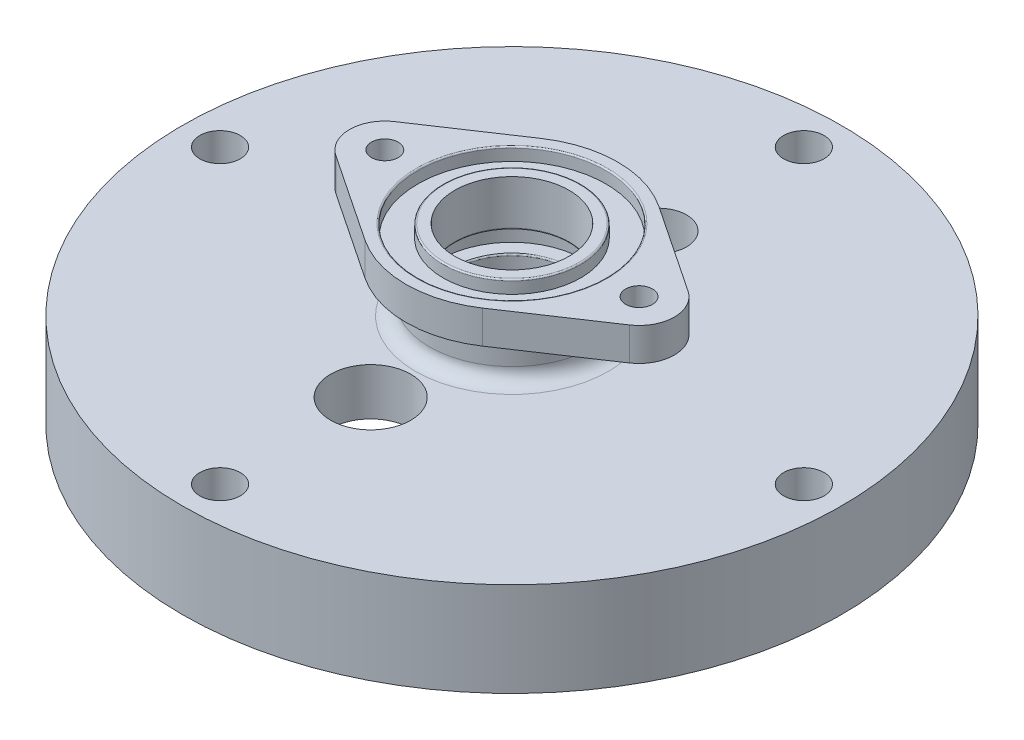
ISO-10303-21;
HEADER;
FILE_DESCRIPTION(('STEP AP214'),'2;1');
FILE_NAME('part.step','',(''),(''),'','','');
FILE_SCHEMA(('AUTOMOTIVE_DESIGN { 1 0 10303 214 1 1 1 1 }'));
ENDSEC;
DATA;
#1=APPLICATION_CONTEXT('core data for automotive mechanical design processes');
#2=APPLICATION_PROTOCOL_DEFINITION('international standard','automotive_design',2000,#1);
#3=PRODUCT_CONTEXT('',#1,'mechanical');
#4=PRODUCT('Part','Part','',(#3));
#5=PRODUCT_RELATED_PRODUCT_CATEGORY('part','',(#4));
#6=PRODUCT_DEFINITION_FORMATION('','',#4);
#7=PRODUCT_DEFINITION_CONTEXT('part definition',#1,'design');
#8=PRODUCT_DEFINITION('design','',#6,#7);
#9=PRODUCT_DEFINITION_SHAPE('','',#8);
#10=(LENGTH_UNIT() NAMED_UNIT(*) SI_UNIT(.MILLI.,.METRE.));
#11=(NAMED_UNIT(*) PLANE_ANGLE_UNIT() SI_UNIT($,.RADIAN.));
#12=(NAMED_UNIT(*) SI_UNIT($,.STERADIAN.) SOLID_ANGLE_UNIT());
#13=UNCERTAINTY_MEASURE_WITH_UNIT(LENGTH_MEASURE(1.E-05),#10,'distance_accuracy_value','');
#14=(GEOMETRIC_REPRESENTATION_CONTEXT(3) GLOBAL_UNCERTAINTY_ASSIGNED_CONTEXT((#13)) GLOBAL_UNIT_ASSIGNED_CONTEXT((#10,
#11,#12)) REPRESENTATION_CONTEXT('',''));
#15=CARTESIAN_POINT('',(0.,0.,0.));
#16=DIRECTION('',(0.,0.,1.));
#17=DIRECTION('',(1.,0.,0.));
#18=AXIS2_PLACEMENT_3D('',#15,#16,#17);
#19=CARTESIAN_POINT('',(0.,0.,0.));
#20=DIRECTION('',(0.,1.,0.));
#21=DIRECTION('',(0.,0.,1.));
#22=AXIS2_PLACEMENT_3D('',#19,#20,#21);
#23=CYLINDRICAL_SURFACE('',#22,12.15);
#24=CARTESIAN_POINT('',(0.,27.5318590738035,0.));
#25=DIRECTION('',(0.,1.,0.));
#26=DIRECTION('',(0.,0.,1.));
#27=AXIS2_PLACEMENT_3D('',#24,#25,#26);
#28=CIRCLE('',#27,12.15);
#29=CARTESIAN_POINT('',(0.,27.5318590738035,12.15));
#30=VERTEX_POINT('',#29);
#31=EDGE_CURVE('E222',#30,#30,#28,.F.);
#32=ORIENTED_EDGE('',*,*,#31,.T.);
#33=EDGE_LOOP('',(#32));
#34=FACE_BOUND('',#33,.T.);
#35=CARTESIAN_POINT('',(0.,37.,0.));
#36=DIRECTION('',(0.,1.,0.));
#37=DIRECTION('',(0.,0.,1.));
#38=AXIS2_PLACEMENT_3D('',#35,#36,#37);
#39=CIRCLE('',#38,12.15);
#40=CARTESIAN_POINT('',(0.,37.,12.15));
#41=VERTEX_POINT('',#40);
#42=EDGE_CURVE('E406',#41,#41,#39,.T.);
#43=ORIENTED_EDGE('',*,*,#42,.T.);
#44=EDGE_LOOP('',(#43));
#45=FACE_BOUND('',#44,.T.);
#46=ADVANCED_FACE('F45',(#34,#45),#23,.F.);
#47=CARTESIAN_POINT('',(-27.,37.,0.));
#48=DIRECTION('',(0.,1.,0.));
#49=DIRECTION('',(0.,0.,1.));
#50=AXIS2_PLACEMENT_3D('',#47,#48,#49);
#51=PLANE('',#50);
#52=CARTESIAN_POINT('',(0.,37.,0.));
#53=DIRECTION('',(0.,1.,0.));
#54=DIRECTION('',(0.,0.,1.));
#55=AXIS2_PLACEMENT_3D('',#52,#53,#54);
#56=CIRCLE('',#55,14.32);
#57=CARTESIAN_POINT('',(0.,37.,14.32));
#58=VERTEX_POINT('',#57);
#59=EDGE_CURVE('E204',#58,#58,#56,.T.);
#60=ORIENTED_EDGE('',*,*,#59,.T.);
#61=EDGE_LOOP('',(#60));
#62=FACE_BOUND('',#61,.T.);
#63=ORIENTED_EDGE('',*,*,#42,.F.);
#64=EDGE_LOOP('',(#63));
#65=FACE_BOUND('',#64,.T.);
#66=ADVANCED_FACE('F249',(#62,#65),#51,.T.);
#67=CARTESIAN_POINT('',(0.,20.,0.));
#68=DIRECTION('',(0.,-1.,0.));
#69=DIRECTION('',(0.,0.,-1.));
#70=AXIS2_PLACEMENT_3D('',#67,#68,#69);
#71=CYLINDRICAL_SURFACE('',#70,70.);
#72=CARTESIAN_POINT('',(0.,20.,0.));
#73=DIRECTION('',(0.,1.,0.));
#74=DIRECTION('',(0.,0.,1.));
#75=AXIS2_PLACEMENT_3D('',#72,#73,#74);
#76=CIRCLE('',#75,70.);
#77=CARTESIAN_POINT('',(0.,20.,70.));
#78=VERTEX_POINT('',#77);
#79=EDGE_CURVE('E193',#78,#78,#76,.T.);
#80=ORIENTED_EDGE('',*,*,#79,.F.);
#81=EDGE_LOOP('',(#80));
#82=FACE_BOUND('',#81,.T.);
#83=CARTESIAN_POINT('',(0.,0.,0.));
#84=DIRECTION('',(0.,1.,0.));
#85=DIRECTION('',(0.,0.,1.));
#86=AXIS2_PLACEMENT_3D('',#83,#84,#85);
#87=CIRCLE('',#86,70.);
#88=CARTESIAN_POINT('',(0.,0.,70.));
#89=VERTEX_POINT('',#88);
#90=EDGE_CURVE('E192',#89,#89,#87,.T.);
#91=ORIENTED_EDGE('',*,*,#90,.T.);
#92=EDGE_LOOP('',(#91));
#93=FACE_BOUND('',#92,.T.);
#94=ADVANCED_FACE('F257',(#82,#93),#71,.T.);
#95=CARTESIAN_POINT('',(0.,20.,0.));
#96=DIRECTION('',(0.,1.,0.));
#97=DIRECTION('',(0.,0.,1.));
#98=AXIS2_PLACEMENT_3D('',#95,#96,#97);
#99=PLANE('',#98);
#100=CARTESIAN_POINT('',(0.,20.,-31.1904562971066));
#101=DIRECTION('',(0.,-1.,0.));
#102=DIRECTION('',(0.,0.,-1.));
#103=AXIS2_PLACEMENT_3D('',#100,#101,#102);
#104=CIRCLE('',#103,5.9);
#105=CARTESIAN_POINT('',(0.,20.,-37.0904562971066));
#106=VERTEX_POINT('',#105);
#107=EDGE_CURVE('E472',#106,#106,#104,.T.);
#108=ORIENTED_EDGE('',*,*,#107,.T.);
#109=EDGE_LOOP('',(#108));
#110=FACE_BOUND('',#109,.T.);
#111=CARTESIAN_POINT('',(0.,20.,30.));
#112=DIRECTION('',(0.,1.,0.));
#113=DIRECTION('',(0.,0.,1.));
#114=AXIS2_PLACEMENT_3D('',#111,#112,#113);
#115=CIRCLE('',#114,8.5);
#116=CARTESIAN_POINT('',(0.,20.,38.5));
#117=VERTEX_POINT('',#116);
#118=EDGE_CURVE('E484',#117,#117,#115,.T.);
#119=ORIENTED_EDGE('',*,*,#118,.F.);
#120=EDGE_LOOP('',(#119));
#121=FACE_BOUND('',#120,.T.);
#122=CARTESIAN_POINT('',(0.,20.,-62.));
#123=DIRECTION('',(0.,1.,0.));
#124=DIRECTION('',(0.,0.,1.));
#125=AXIS2_PLACEMENT_3D('',#122,#123,#124);
#126=CIRCLE('',#125,4.3);
#127=CARTESIAN_POINT('',(0.,20.,-57.7));
#128=VERTEX_POINT('',#127);
#129=EDGE_CURVE('E492',#128,#128,#126,.T.);
#130=ORIENTED_EDGE('',*,*,#129,.F.);
#131=EDGE_LOOP('',(#130));
#132=FACE_BOUND('',#131,.T.);
#133=CARTESIAN_POINT('',(62.0000000000018,20.,-1.75455317453033E-12));
#134=DIRECTION('',(0.,1.,0.));
#135=DIRECTION('',(0.,0.,1.));
#136=AXIS2_PLACEMENT_3D('',#133,#134,#135);
#137=CIRCLE('',#136,4.30000000000001);
#138=CARTESIAN_POINT('',(62.0000000000018,20.,4.29999999999825));
#139=VERTEX_POINT('',#138);
#140=EDGE_CURVE('E498',#139,#139,#137,.T.);
#141=ORIENTED_EDGE('',*,*,#140,.F.);
#142=EDGE_LOOP('',(#141));
#143=FACE_BOUND('',#142,.T.);
#144=CARTESIAN_POINT('',(3.50910634906067E-12,20.,62.));
#145=DIRECTION('',(0.,1.,0.));
#146=DIRECTION('',(0.,0.,1.));
#147=AXIS2_PLACEMENT_3D('',#144,#145,#146);
#148=CIRCLE('',#147,4.3);
#149=CARTESIAN_POINT('',(3.50910634906067E-12,20.,66.3));
#150=VERTEX_POINT('',#149);
#151=EDGE_CURVE('E504',#150,#150,#148,.T.);
#152=ORIENTED_EDGE('',*,*,#151,.F.);
#153=EDGE_LOOP('',(#152));
#154=FACE_BOUND('',#153,.T.);
#155=CARTESIAN_POINT('',(-61.9999999999983,20.,1.76214598468505E-12));
#156=DIRECTION('',(0.,1.,0.));
#157=DIRECTION('',(0.,0.,1.));
#158=AXIS2_PLACEMENT_3D('',#155,#156,#157);
#159=CIRCLE('',#158,4.3);
#160=CARTESIAN_POINT('',(-61.9999999999983,20.,4.30000000000176));
#161=VERTEX_POINT('',#160);
#162=EDGE_CURVE('E487',#161,#161,#159,.T.);
#163=ORIENTED_EDGE('',*,*,#162,.F.);
#164=EDGE_LOOP('',(#163));
#165=FACE_BOUND('',#164,.T.);
#166=CARTESIAN_POINT('',(0.,20.,0.));
#167=DIRECTION('',(0.,1.,0.));
#168=DIRECTION('',(0.,0.,1.));
#169=AXIS2_PLACEMENT_3D('',#166,#167,#168);
#170=CIRCLE('',#169,20.5);
#171=CARTESIAN_POINT('',(0.,20.,20.5));
#172=VERTEX_POINT('',#171);
#173=EDGE_CURVE('E219',#172,#172,#170,.F.);
#174=ORIENTED_EDGE('',*,*,#173,.T.);
#175=EDGE_LOOP('',(#174));
#176=FACE_BOUND('',#175,.T.);
#177=ORIENTED_EDGE('',*,*,#79,.T.);
#178=EDGE_LOOP('',(#177));
#179=FACE_BOUND('',#178,.T.);
#180=ADVANCED_FACE('F342',(#110,#121,#132,#143,#154,#165,#176,#179),#99,.T.);
#181=CARTESIAN_POINT('',(0.,0.,0.));
#182=DIRECTION('',(0.,1.,0.));
#183=DIRECTION('',(0.,0.,1.));
#184=AXIS2_PLACEMENT_3D('',#181,#182,#183);
#185=PLANE('',#184);
#186=CARTESIAN_POINT('',(0.,0.,-62.));
#187=DIRECTION('',(0.,1.,0.));
#188=DIRECTION('',(0.,0.,1.));
#189=AXIS2_PLACEMENT_3D('',#186,#187,#188);
#190=CIRCLE('',#189,4.3);
#191=CARTESIAN_POINT('',(0.,0.,-57.7));
#192=VERTEX_POINT('',#191);
#193=EDGE_CURVE('E488',#192,#192,#190,.T.);
#194=ORIENTED_EDGE('',*,*,#193,.T.);
#195=EDGE_LOOP('',(#194));
#196=FACE_BOUND('',#195,.T.);
#197=CARTESIAN_POINT('',(62.0000000000018,0.,-1.75455317453033E-12));
#198=DIRECTION('',(0.,1.,0.));
#199=DIRECTION('',(0.,0.,1.));
#200=AXIS2_PLACEMENT_3D('',#197,#198,#199);
#201=CIRCLE('',#200,4.30000000000001);
#202=CARTESIAN_POINT('',(62.0000000000018,0.,4.29999999999825));
#203=VERTEX_POINT('',#202);
#204=EDGE_CURVE('E495',#203,#203,#201,.T.);
#205=ORIENTED_EDGE('',*,*,#204,.T.);
#206=EDGE_LOOP('',(#205));
#207=FACE_BOUND('',#206,.T.);
#208=CARTESIAN_POINT('',(3.50910634906067E-12,0.,62.));
#209=DIRECTION('',(0.,1.,0.));
#210=DIRECTION('',(0.,0.,1.));
#211=AXIS2_PLACEMENT_3D('',#208,#209,#210);
#212=CIRCLE('',#211,4.3);
#213=CARTESIAN_POINT('',(3.50910634906067E-12,0.,66.3));
#214=VERTEX_POINT('',#213);
#215=EDGE_CURVE('E501',#214,#214,#212,.T.);
#216=ORIENTED_EDGE('',*,*,#215,.T.);
#217=EDGE_LOOP('',(#216));
#218=FACE_BOUND('',#217,.T.);
#219=CARTESIAN_POINT('',(-61.9999999999983,0.,1.76214598468505E-12));
#220=DIRECTION('',(0.,1.,0.));
#221=DIRECTION('',(0.,0.,1.));
#222=AXIS2_PLACEMENT_3D('',#219,#220,#221);
#223=CIRCLE('',#222,4.3);
#224=CARTESIAN_POINT('',(-61.9999999999983,0.,4.30000000000176));
#225=VERTEX_POINT('',#224);
#226=EDGE_CURVE('E507',#225,#225,#223,.T.);
#227=ORIENTED_EDGE('',*,*,#226,.T.);
#228=EDGE_LOOP('',(#227));
#229=FACE_BOUND('',#228,.T.);
#230=CARTESIAN_POINT('',(0.,0.,0.));
#231=DIRECTION('',(0.,-1.,0.));
#232=DIRECTION('',(0.,0.,-1.));
#233=AXIS2_PLACEMENT_3D('',#230,#231,#232);
#234=CIRCLE('',#233,50.03);
#235=CARTESIAN_POINT('',(0.,0.,-50.03));
#236=VERTEX_POINT('',#235);
#237=EDGE_CURVE('E189',#236,#236,#234,.T.);
#238=ORIENTED_EDGE('',*,*,#237,.F.);
#239=EDGE_LOOP('',(#238));
#240=FACE_BOUND('',#239,.T.);
#241=ORIENTED_EDGE('',*,*,#90,.F.);
#242=EDGE_LOOP('',(#241));
#243=FACE_BOUND('',#242,.T.);
#244=ADVANCED_FACE('F340',(#196,#207,#218,#229,#240,#243),#185,.F.);
#245=CARTESIAN_POINT('',(0.,10.,0.));
#246=DIRECTION('',(0.,-1.,0.));
#247=DIRECTION('',(0.,0.,-1.));
#248=AXIS2_PLACEMENT_3D('',#245,#246,#247);
#249=CYLINDRICAL_SURFACE('',#248,45.);
#250=CARTESIAN_POINT('',(0.,0.,0.));
#251=DIRECTION('',(0.,-1.,0.));
#252=DIRECTION('',(0.,0.,-1.));
#253=AXIS2_PLACEMENT_3D('',#250,#251,#252);
#254=CIRCLE('',#253,45.);
#255=CARTESIAN_POINT('',(0.,0.,-45.));
#256=VERTEX_POINT('',#255);
#257=EDGE_CURVE('E184',#256,#256,#254,.T.);
#258=ORIENTED_EDGE('',*,*,#257,.F.);
#259=EDGE_LOOP('',(#258));
#260=FACE_BOUND('',#259,.T.);
#261=CARTESIAN_POINT('',(0.,13.,0.));
#262=DIRECTION('',(0.,-1.,0.));
#263=DIRECTION('',(0.,0.,-1.));
#264=AXIS2_PLACEMENT_3D('',#261,#262,#263);
#265=CIRCLE('',#264,45.);
#266=CARTESIAN_POINT('',(0.,13.,-45.));
#267=VERTEX_POINT('',#266);
#268=EDGE_CURVE('E469',#267,#267,#265,.T.);
#269=ORIENTED_EDGE('',*,*,#268,.T.);
#270=EDGE_LOOP('',(#269));
#271=FACE_BOUND('',#270,.T.);
#272=ADVANCED_FACE('F336',(#260,#271),#249,.T.);
#273=CARTESIAN_POINT('',(0.,10.,0.));
#274=DIRECTION('',(0.,-1.,0.));
#275=DIRECTION('',(0.,0.,-1.));
#276=AXIS2_PLACEMENT_3D('',#273,#274,#275);
#277=CYLINDRICAL_SURFACE('',#276,50.03);
#278=ORIENTED_EDGE('',*,*,#237,.T.);
#279=EDGE_LOOP('',(#278));
#280=FACE_BOUND('',#279,.T.);
#281=CARTESIAN_POINT('',(0.,13.,0.));
#282=DIRECTION('',(0.,-1.,0.));
#283=DIRECTION('',(0.,0.,-1.));
#284=AXIS2_PLACEMENT_3D('',#281,#282,#283);
#285=CIRCLE('',#284,50.03);
#286=CARTESIAN_POINT('',(0.,13.,-50.03));
#287=VERTEX_POINT('',#286);
#288=EDGE_CURVE('E471',#287,#287,#285,.T.);
#289=ORIENTED_EDGE('',*,*,#288,.F.);
#290=EDGE_LOOP('',(#289));
#291=FACE_BOUND('',#290,.T.);
#292=ADVANCED_FACE('F333',(#280,#291),#277,.F.);
#293=CARTESIAN_POINT('',(0.,0.,0.));
#294=DIRECTION('',(0.,-1.,0.));
#295=DIRECTION('',(0.,0.,-1.));
#296=AXIS2_PLACEMENT_3D('',#293,#294,#295);
#297=CIRCLE('',#296,41.);
#298=CARTESIAN_POINT('',(0.,0.,-41.));
#299=VERTEX_POINT('',#298);
#300=EDGE_CURVE('E180',#299,#299,#297,.T.);
#301=ORIENTED_EDGE('',*,*,#300,.F.);
#302=EDGE_LOOP('',(#301));
#303=FACE_BOUND('',#302,.T.);
#304=ORIENTED_EDGE('',*,*,#257,.T.);
#305=EDGE_LOOP('',(#304));
#306=FACE_BOUND('',#305,.T.);
#307=ADVANCED_FACE('F331',(#303,#306),#185,.F.);
#308=CARTESIAN_POINT('',(0.,10.,0.));
#309=DIRECTION('',(0.,-1.,0.));
#310=DIRECTION('',(0.,0.,-1.));
#311=AXIS2_PLACEMENT_3D('',#308,#309,#310);
#312=CYLINDRICAL_SURFACE('',#311,41.);
#313=CARTESIAN_POINT('',(0.,10.,0.));
#314=DIRECTION('',(0.,-1.,0.));
#315=DIRECTION('',(0.,0.,-1.));
#316=AXIS2_PLACEMENT_3D('',#313,#314,#315);
#317=CIRCLE('',#316,41.);
#318=CARTESIAN_POINT('',(0.,10.,-41.));
#319=VERTEX_POINT('',#318);
#320=EDGE_CURVE('E181',#319,#319,#317,.T.);
#321=ORIENTED_EDGE('',*,*,#320,.F.);
#322=EDGE_LOOP('',(#321));
#323=FACE_BOUND('',#322,.T.);
#324=ORIENTED_EDGE('',*,*,#300,.T.);
#325=EDGE_LOOP('',(#324));
#326=FACE_BOUND('',#325,.T.);
#327=ADVANCED_FACE('F327',(#323,#326),#312,.F.);
#328=CARTESIAN_POINT('',(0.,10.,0.));
#329=DIRECTION('',(0.,-1.,0.));
#330=DIRECTION('',(0.,0.,-1.));
#331=AXIS2_PLACEMENT_3D('',#328,#329,#330);
#332=PLANE('',#331);
#333=CARTESIAN_POINT('',(0.,10.,-31.1904562971066));
#334=DIRECTION('',(0.,-1.,0.));
#335=DIRECTION('',(0.,0.,-1.));
#336=AXIS2_PLACEMENT_3D('',#333,#334,#335);
#337=CIRCLE('',#336,5.9);
#338=CARTESIAN_POINT('',(0.,10.,-37.0904562971066));
#339=VERTEX_POINT('',#338);
#340=EDGE_CURVE('E478',#339,#339,#337,.T.);
#341=ORIENTED_EDGE('',*,*,#340,.F.);
#342=EDGE_LOOP('',(#341));
#343=FACE_BOUND('',#342,.T.);
#344=CARTESIAN_POINT('',(0.,10.,30.));
#345=DIRECTION('',(0.,-1.,0.));
#346=DIRECTION('',(0.,0.,-1.));
#347=AXIS2_PLACEMENT_3D('',#344,#345,#346);
#348=CIRCLE('',#347,8.5);
#349=CARTESIAN_POINT('',(0.,10.,21.5));
#350=VERTEX_POINT('',#349);
#351=EDGE_CURVE('E475',#350,#350,#348,.T.);
#352=ORIENTED_EDGE('',*,*,#351,.F.);
#353=EDGE_LOOP('',(#352));
#354=FACE_BOUND('',#353,.T.);
#355=CARTESIAN_POINT('',(0.,10.,0.));
#356=DIRECTION('',(0.,-1.,0.));
#357=DIRECTION('',(0.,0.,-1.));
#358=AXIS2_PLACEMENT_3D('',#355,#356,#357);
#359=CIRCLE('',#358,17.35);
#360=CARTESIAN_POINT('',(0.,10.,-17.35));
#361=VERTEX_POINT('',#360);
#362=EDGE_CURVE('E174',#361,#361,#359,.T.);
#363=ORIENTED_EDGE('',*,*,#362,.F.);
#364=EDGE_LOOP('',(#363));
#365=FACE_BOUND('',#364,.T.);
#366=ORIENTED_EDGE('',*,*,#320,.T.);
#367=EDGE_LOOP('',(#366));
#368=FACE_BOUND('',#367,.T.);
#369=ADVANCED_FACE('F323',(#343,#354,#365,#368),#332,.T.);
#370=CARTESIAN_POINT('',(0.,10.,0.));
#371=DIRECTION('',(0.,1.,0.));
#372=DIRECTION('',(0.,0.,1.));
#373=AXIS2_PLACEMENT_3D('',#370,#371,#372);
#374=CONICAL_SURFACE('',#373,17.35,0.358770670270572);
#375=CARTESIAN_POINT('',(0.,0.,0.));
#376=DIRECTION('',(0.,-1.,0.));
#377=DIRECTION('',(0.,0.,-1.));
#378=AXIS2_PLACEMENT_3D('',#375,#376,#377);
#379=CIRCLE('',#378,13.6);
#380=CARTESIAN_POINT('',(0.,0.,-13.6));
#381=VERTEX_POINT('',#380);
#382=EDGE_CURVE('E177',#381,#381,#379,.T.);
#383=ORIENTED_EDGE('',*,*,#382,.F.);
#384=EDGE_LOOP('',(#383));
#385=FACE_BOUND('',#384,.T.);
#386=ORIENTED_EDGE('',*,*,#362,.T.);
#387=EDGE_LOOP('',(#386));
#388=FACE_BOUND('',#387,.T.);
#389=ADVANCED_FACE('F320',(#385,#388),#374,.T.);
#390=CARTESIAN_POINT('',(0.,0.,0.));
#391=DIRECTION('',(0.,1.,0.));
#392=DIRECTION('',(0.,0.,1.));
#393=AXIS2_PLACEMENT_3D('',#390,#391,#392);
#394=CIRCLE('',#393,12.15);
#395=CARTESIAN_POINT('',(0.,0.,12.15));
#396=VERTEX_POINT('',#395);
#397=EDGE_CURVE('E409',#396,#396,#394,.T.);
#398=ORIENTED_EDGE('',*,*,#397,.T.);
#399=EDGE_LOOP('',(#398));
#400=FACE_BOUND('',#399,.T.);
#401=ORIENTED_EDGE('',*,*,#382,.T.);
#402=EDGE_LOOP('',(#401));
#403=FACE_BOUND('',#402,.T.);
#404=ADVANCED_FACE('F318',(#400,#403),#185,.F.);
#405=CARTESIAN_POINT('',(0.,30.,0.));
#406=DIRECTION('',(0.,-1.,0.));
#407=DIRECTION('',(0.,0.,-1.));
#408=AXIS2_PLACEMENT_3D('',#405,#406,#407);
#409=CYLINDRICAL_SURFACE('',#408,17.5);
#410=CARTESIAN_POINT('',(0.,27.,0.));
#411=DIRECTION('',(0.,1.,0.));
#412=DIRECTION('',(0.,0.,1.));
#413=AXIS2_PLACEMENT_3D('',#410,#411,#412);
#414=CIRCLE('',#413,17.5);
#415=CARTESIAN_POINT('',(0.,27.,17.5));
#416=VERTEX_POINT('',#415);
#417=EDGE_CURVE('E216',#416,#416,#414,.F.);
#418=ORIENTED_EDGE('',*,*,#417,.T.);
#419=EDGE_LOOP('',(#418));
#420=FACE_BOUND('',#419,.T.);
#421=CARTESIAN_POINT('',(0.,23.,0.));
#422=DIRECTION('',(0.,1.,0.));
#423=DIRECTION('',(0.,0.,1.));
#424=AXIS2_PLACEMENT_3D('',#421,#422,#423);
#425=CIRCLE('',#424,17.5);
#426=CARTESIAN_POINT('',(0.,23.,17.5));
#427=VERTEX_POINT('',#426);
#428=EDGE_CURVE('E213',#427,#427,#425,.T.);
#429=ORIENTED_EDGE('',*,*,#428,.T.);
#430=EDGE_LOOP('',(#429));
#431=FACE_BOUND('',#430,.T.);
#432=ADVANCED_FACE('F286',(#420,#431),#409,.T.);
#433=CARTESIAN_POINT('',(0.,37.,0.));
#434=DIRECTION('',(0.,1.,0.));
#435=DIRECTION('',(0.,0.,1.));
#436=AXIS2_PLACEMENT_3D('',#433,#434,#435);
#437=CIRCLE('',#436,20.28);
#438=CARTESIAN_POINT('',(0.,37.,20.28));
#439=VERTEX_POINT('',#438);
#440=EDGE_CURVE('E201',#439,#439,#437,.F.);
#441=ORIENTED_EDGE('',*,*,#440,.T.);
#442=EDGE_LOOP('',(#441));
#443=FACE_BOUND('',#442,.T.);
#444=CARTESIAN_POINT('',(-27.,37.,0.));
#445=DIRECTION('',(0.,1.,0.));
#446=DIRECTION('',(0.,0.,1.));
#447=AXIS2_PLACEMENT_3D('',#444,#445,#446);
#448=CIRCLE('',#447,2.85);
#449=CARTESIAN_POINT('',(-27.,37.,2.85000000000001));
#450=VERTEX_POINT('',#449);
#451=EDGE_CURVE('E148',#450,#450,#448,.T.);
#452=ORIENTED_EDGE('',*,*,#451,.F.);
#453=EDGE_LOOP('',(#452));
#454=FACE_BOUND('',#453,.T.);
#455=CARTESIAN_POINT('',(-27.,37.,0.));
#456=DIRECTION('',(0.,1.,0.));
#457=DIRECTION('',(0.,0.,1.));
#458=AXIS2_PLACEMENT_3D('',#455,#456,#457);
#459=CIRCLE('',#458,7.5);
#460=CARTESIAN_POINT('',(-31.1666666666667,37.,-6.23609564462323));
#461=VERTEX_POINT('',#460);
#462=CARTESIAN_POINT('',(-31.1666666666667,37.,6.23609564462324));
#463=VERTEX_POINT('',#462);
#464=EDGE_CURVE('E159',#461,#463,#459,.T.);
#465=ORIENTED_EDGE('',*,*,#464,.T.);
#466=DIRECTION('',(0.831479419283098,0.,0.555555555555556));
#467=VECTOR('',#466,1.);
#468=CARTESIAN_POINT('',(-12.5,37.,18.7082869338697));
#469=LINE('',#468,#467);
#470=CARTESIAN_POINT('',(-12.5,37.,18.7082869338697));
#471=VERTEX_POINT('',#470);
#472=EDGE_CURVE('E106',#463,#471,#469,.T.);
#473=ORIENTED_EDGE('',*,*,#472,.T.);
#474=CARTESIAN_POINT('',(0.,37.,0.));
#475=DIRECTION('',(0.,1.,0.));
#476=DIRECTION('',(0.,0.,1.));
#477=AXIS2_PLACEMENT_3D('',#474,#475,#476);
#478=CIRCLE('',#477,22.5);
#479=CARTESIAN_POINT('',(12.5,37.,18.7082869338697));
#480=VERTEX_POINT('',#479);
#481=EDGE_CURVE('E429',#471,#480,#478,.T.);
#482=ORIENTED_EDGE('',*,*,#481,.T.);
#483=DIRECTION('',(0.831479419283098,0.,-0.555555555555555));
#484=VECTOR('',#483,1.);
#485=CARTESIAN_POINT('',(31.1666666666667,37.,6.23609564462324));
#486=LINE('',#485,#484);
#487=CARTESIAN_POINT('',(31.1666666666667,37.,6.23609564462324));
#488=VERTEX_POINT('',#487);
#489=EDGE_CURVE('E431',#480,#488,#486,.T.);
#490=ORIENTED_EDGE('',*,*,#489,.T.);
#491=CARTESIAN_POINT('',(27.,37.,0.));
#492=DIRECTION('',(0.,1.,0.));
#493=DIRECTION('',(0.,0.,1.));
#494=AXIS2_PLACEMENT_3D('',#491,#492,#493);
#495=CIRCLE('',#494,7.5);
#496=CARTESIAN_POINT('',(31.1666666666667,37.,-6.23609564462323));
#497=VERTEX_POINT('',#496);
#498=EDGE_CURVE('E126',#488,#497,#495,.T.);
#499=ORIENTED_EDGE('',*,*,#498,.T.);
#500=DIRECTION('',(-0.831479419283098,0.,-0.555555555555555));
#501=VECTOR('',#500,1.);
#502=CARTESIAN_POINT('',(31.1666666666667,37.,-6.23609564462323));
#503=LINE('',#502,#501);
#504=CARTESIAN_POINT('',(12.5,37.,-18.7082869338697));
#505=VERTEX_POINT('',#504);
#506=EDGE_CURVE('E119',#497,#505,#503,.T.);
#507=ORIENTED_EDGE('',*,*,#506,.T.);
#508=CARTESIAN_POINT('',(0.,37.,0.));
#509=DIRECTION('',(0.,1.,0.));
#510=DIRECTION('',(0.,0.,1.));
#511=AXIS2_PLACEMENT_3D('',#508,#509,#510);
#512=CIRCLE('',#511,22.5);
#513=CARTESIAN_POINT('',(-12.5,37.,-18.7082869338697));
#514=VERTEX_POINT('',#513);
#515=EDGE_CURVE('E124',#505,#514,#512,.T.);
#516=ORIENTED_EDGE('',*,*,#515,.T.);
#517=DIRECTION('',(-0.831479419283098,0.,0.555555555555556));
#518=VECTOR('',#517,1.);
#519=CARTESIAN_POINT('',(-12.5,37.,-18.7082869338697));
#520=LINE('',#519,#518);
#521=EDGE_CURVE('E62',#514,#461,#520,.T.);
#522=ORIENTED_EDGE('',*,*,#521,.T.);
#523=EDGE_LOOP('',(#465,#473,#482,#490,#499,#507,#516,#522));
#524=FACE_BOUND('',#523,.T.);
#525=CARTESIAN_POINT('',(27.,37.,0.));
#526=DIRECTION('',(0.,1.,0.));
#527=DIRECTION('',(0.,0.,1.));
#528=AXIS2_PLACEMENT_3D('',#525,#526,#527);
#529=CIRCLE('',#528,2.85);
#530=CARTESIAN_POINT('',(27.,37.,2.85));
#531=VERTEX_POINT('',#530);
#532=EDGE_CURVE('E418',#531,#531,#529,.T.);
#533=ORIENTED_EDGE('',*,*,#532,.F.);
#534=EDGE_LOOP('',(#533));
#535=FACE_BOUND('',#534,.T.);
#536=ADVANCED_FACE('F121',(#443,#454,#524,#535),#51,.T.);
#537=CARTESIAN_POINT('',(-27.,30.,0.));
#538=DIRECTION('',(0.,1.,0.));
#539=DIRECTION('',(0.,0.,1.));
#540=AXIS2_PLACEMENT_3D('',#537,#538,#539);
#541=PLANE('',#540);
#542=CARTESIAN_POINT('',(0.,30.,0.));
#543=DIRECTION('',(0.,1.,0.));
#544=DIRECTION('',(0.,0.,1.));
#545=AXIS2_PLACEMENT_3D('',#542,#543,#544);
#546=CIRCLE('',#545,20.5);
#547=CARTESIAN_POINT('',(0.,30.,20.5));
#548=VERTEX_POINT('',#547);
#549=EDGE_CURVE('E210',#548,#548,#546,.T.);
#550=ORIENTED_EDGE('',*,*,#549,.T.);
#551=EDGE_LOOP('',(#550));
#552=FACE_BOUND('',#551,.T.);
#553=CARTESIAN_POINT('',(-27.,30.,0.));
#554=DIRECTION('',(0.,1.,0.));
#555=DIRECTION('',(0.,0.,1.));
#556=AXIS2_PLACEMENT_3D('',#553,#554,#555);
#557=CIRCLE('',#556,7.5);
#558=CARTESIAN_POINT('',(-31.1666666666667,30.,-6.23609564462323));
#559=VERTEX_POINT('',#558);
#560=CARTESIAN_POINT('',(-31.1666666666667,30.,6.23609564462324));
#561=VERTEX_POINT('',#560);
#562=EDGE_CURVE('E144',#559,#561,#557,.T.);
#563=ORIENTED_EDGE('',*,*,#562,.F.);
#564=DIRECTION('',(-0.831479419283098,0.,0.555555555555556));
#565=VECTOR('',#564,1.);
#566=CARTESIAN_POINT('',(-12.5,30.,-18.7082869338697));
#567=LINE('',#566,#565);
#568=CARTESIAN_POINT('',(-12.5,30.,-18.7082869338697));
#569=VERTEX_POINT('',#568);
#570=EDGE_CURVE('E97',#569,#559,#567,.T.);
#571=ORIENTED_EDGE('',*,*,#570,.F.);
#572=CARTESIAN_POINT('',(0.,30.,0.));
#573=DIRECTION('',(0.,1.,0.));
#574=DIRECTION('',(0.,0.,1.));
#575=AXIS2_PLACEMENT_3D('',#572,#573,#574);
#576=CIRCLE('',#575,22.5);
#577=CARTESIAN_POINT('',(12.5,30.,-18.7082869338697));
#578=VERTEX_POINT('',#577);
#579=EDGE_CURVE('E91',#578,#569,#576,.T.);
#580=ORIENTED_EDGE('',*,*,#579,.F.);
#581=DIRECTION('',(-0.831479419283098,0.,-0.555555555555555));
#582=VECTOR('',#581,1.);
#583=CARTESIAN_POINT('',(31.1666666666667,30.,-6.23609564462323));
#584=LINE('',#583,#582);
#585=CARTESIAN_POINT('',(31.1666666666667,30.,-6.23609564462323));
#586=VERTEX_POINT('',#585);
#587=EDGE_CURVE('E134',#586,#578,#584,.T.);
#588=ORIENTED_EDGE('',*,*,#587,.F.);
#589=CARTESIAN_POINT('',(27.,30.,0.));
#590=DIRECTION('',(0.,1.,0.));
#591=DIRECTION('',(0.,0.,1.));
#592=AXIS2_PLACEMENT_3D('',#589,#590,#591);
#593=CIRCLE('',#592,7.5);
#594=CARTESIAN_POINT('',(31.1666666666667,30.,6.23609564462324));
#595=VERTEX_POINT('',#594);
#596=EDGE_CURVE('E154',#595,#586,#593,.T.);
#597=ORIENTED_EDGE('',*,*,#596,.F.);
#598=DIRECTION('',(0.831479419283098,0.,-0.555555555555555));
#599=VECTOR('',#598,1.);
#600=CARTESIAN_POINT('',(31.1666666666667,30.,6.23609564462324));
#601=LINE('',#600,#599);
#602=CARTESIAN_POINT('',(12.5,30.,18.7082869338697));
#603=VERTEX_POINT('',#602);
#604=EDGE_CURVE('E152',#603,#595,#601,.T.);
#605=ORIENTED_EDGE('',*,*,#604,.F.);
#606=CARTESIAN_POINT('',(0.,30.,0.));
#607=DIRECTION('',(0.,1.,0.));
#608=DIRECTION('',(0.,0.,1.));
#609=AXIS2_PLACEMENT_3D('',#606,#607,#608);
#610=CIRCLE('',#609,22.5);
#611=CARTESIAN_POINT('',(-12.5,30.,18.7082869338697));
#612=VERTEX_POINT('',#611);
#613=EDGE_CURVE('E150',#612,#603,#610,.T.);
#614=ORIENTED_EDGE('',*,*,#613,.F.);
#615=DIRECTION('',(0.831479419283098,0.,0.555555555555556));
#616=VECTOR('',#615,1.);
#617=CARTESIAN_POINT('',(-12.5,30.,18.7082869338697));
#618=LINE('',#617,#616);
#619=EDGE_CURVE('E147',#561,#612,#618,.T.);
#620=ORIENTED_EDGE('',*,*,#619,.F.);
#621=EDGE_LOOP('',(#563,#571,#580,#588,#597,#605,#614,#620));
#622=FACE_BOUND('',#621,.T.);
#623=CARTESIAN_POINT('',(-27.,30.,0.));
#624=DIRECTION('',(0.,1.,0.));
#625=DIRECTION('',(0.,0.,1.));
#626=AXIS2_PLACEMENT_3D('',#623,#624,#625);
#627=CIRCLE('',#626,2.85);
#628=CARTESIAN_POINT('',(-27.,30.,2.85000000000001));
#629=VERTEX_POINT('',#628);
#630=EDGE_CURVE('E420',#629,#629,#627,.T.);
#631=ORIENTED_EDGE('',*,*,#630,.T.);
#632=EDGE_LOOP('',(#631));
#633=FACE_BOUND('',#632,.T.);
#634=CARTESIAN_POINT('',(27.,30.,0.));
#635=DIRECTION('',(0.,1.,0.));
#636=DIRECTION('',(0.,0.,1.));
#637=AXIS2_PLACEMENT_3D('',#634,#635,#636);
#638=CIRCLE('',#637,2.85);
#639=CARTESIAN_POINT('',(27.,30.,2.85));
#640=VERTEX_POINT('',#639);
#641=EDGE_CURVE('E416',#640,#640,#638,.T.);
#642=ORIENTED_EDGE('',*,*,#641,.T.);
#643=EDGE_LOOP('',(#642));
#644=FACE_BOUND('',#643,.T.);
#645=ADVANCED_FACE('F285',(#552,#622,#633,#644),#541,.F.);
#646=CARTESIAN_POINT('',(-27.,37.,0.));
#647=DIRECTION('',(0.,-1.,0.));
#648=DIRECTION('',(0.,0.,-1.));
#649=AXIS2_PLACEMENT_3D('',#646,#647,#648);
#650=CYLINDRICAL_SURFACE('',#649,7.5);
#651=ORIENTED_EDGE('',*,*,#562,.T.);
#652=DIRECTION('',(0.,-1.,0.));
#653=VECTOR('',#652,1.);
#654=CARTESIAN_POINT('',(-31.1666666666667,37.,6.23609564462324));
#655=LINE('',#654,#653);
#656=EDGE_CURVE('E172',#463,#561,#655,.T.);
#657=ORIENTED_EDGE('',*,*,#656,.F.);
#658=ORIENTED_EDGE('',*,*,#464,.F.);
#659=DIRECTION('',(0.,-1.,0.));
#660=VECTOR('',#659,1.);
#661=CARTESIAN_POINT('',(-31.1666666666667,37.,-6.23609564462323));
#662=LINE('',#661,#660);
#663=EDGE_CURVE('E140',#461,#559,#662,.T.);
#664=ORIENTED_EDGE('',*,*,#663,.T.);
#665=EDGE_LOOP('',(#651,#657,#658,#664));
#666=FACE_BOUND('',#665,.T.);
#667=ADVANCED_FACE('F290',(#666),#650,.T.);
#668=CARTESIAN_POINT('',(-12.5,37.,18.7082869338697));
#669=DIRECTION('',(0.555555555555556,0.,-0.831479419283098));
#670=DIRECTION('',(-0.831479419283098,0.,-0.555555555555556));
#671=AXIS2_PLACEMENT_3D('',#668,#669,#670);
#672=PLANE('',#671);
#673=ORIENTED_EDGE('',*,*,#619,.T.);
#674=DIRECTION('',(0.,-1.,0.));
#675=VECTOR('',#674,1.);
#676=CARTESIAN_POINT('',(-12.5,37.,18.7082869338697));
#677=LINE('',#676,#675);
#678=EDGE_CURVE('E169',#471,#612,#677,.T.);
#679=ORIENTED_EDGE('',*,*,#678,.F.);
#680=ORIENTED_EDGE('',*,*,#472,.F.);
#681=ORIENTED_EDGE('',*,*,#656,.T.);
#682=EDGE_LOOP('',(#673,#679,#680,#681));
#683=FACE_BOUND('',#682,.T.);
#684=ADVANCED_FACE('F309',(#683),#672,.F.);
#685=CARTESIAN_POINT('',(0.,37.,0.));
#686=DIRECTION('',(0.,-1.,0.));
#687=DIRECTION('',(0.,0.,-1.));
#688=AXIS2_PLACEMENT_3D('',#685,#686,#687);
#689=CYLINDRICAL_SURFACE('',#688,22.5);
#690=ORIENTED_EDGE('',*,*,#613,.T.);
#691=DIRECTION('',(0.,-1.,0.));
#692=VECTOR('',#691,1.);
#693=CARTESIAN_POINT('',(12.5,37.,18.7082869338697));
#694=LINE('',#693,#692);
#695=EDGE_CURVE('E166',#480,#603,#694,.T.);
#696=ORIENTED_EDGE('',*,*,#695,.F.);
#697=ORIENTED_EDGE('',*,*,#481,.F.);
#698=ORIENTED_EDGE('',*,*,#678,.T.);
#699=EDGE_LOOP('',(#690,#696,#697,#698));
#700=FACE_BOUND('',#699,.T.);
#701=ADVANCED_FACE('F305',(#700),#689,.T.);
#702=CARTESIAN_POINT('',(31.1666666666667,37.,6.23609564462324));
#703=DIRECTION('',(-0.555555555555555,0.,-0.831479419283098));
#704=DIRECTION('',(-0.831479419283098,0.,0.555555555555555));
#705=AXIS2_PLACEMENT_3D('',#702,#703,#704);
#706=PLANE('',#705);
#707=ORIENTED_EDGE('',*,*,#604,.T.);
#708=DIRECTION('',(0.,-1.,0.));
#709=VECTOR('',#708,1.);
#710=CARTESIAN_POINT('',(31.1666666666667,37.,6.23609564462324));
#711=LINE('',#710,#709);
#712=EDGE_CURVE('E163',#488,#595,#711,.T.);
#713=ORIENTED_EDGE('',*,*,#712,.F.);
#714=ORIENTED_EDGE('',*,*,#489,.F.);
#715=ORIENTED_EDGE('',*,*,#695,.T.);
#716=EDGE_LOOP('',(#707,#713,#714,#715));
#717=FACE_BOUND('',#716,.T.);
#718=ADVANCED_FACE('F301',(#717),#706,.F.);
#719=CARTESIAN_POINT('',(27.,37.,0.));
#720=DIRECTION('',(0.,-1.,0.));
#721=DIRECTION('',(0.,0.,-1.));
#722=AXIS2_PLACEMENT_3D('',#719,#720,#721);
#723=CYLINDRICAL_SURFACE('',#722,7.5);
#724=ORIENTED_EDGE('',*,*,#596,.T.);
#725=DIRECTION('',(0.,-1.,0.));
#726=VECTOR('',#725,1.);
#727=CARTESIAN_POINT('',(31.1666666666667,37.,-6.23609564462323));
#728=LINE('',#727,#726);
#729=EDGE_CURVE('E135',#497,#586,#728,.T.);
#730=ORIENTED_EDGE('',*,*,#729,.F.);
#731=ORIENTED_EDGE('',*,*,#498,.F.);
#732=ORIENTED_EDGE('',*,*,#712,.T.);
#733=EDGE_LOOP('',(#724,#730,#731,#732));
#734=FACE_BOUND('',#733,.T.);
#735=ADVANCED_FACE('F298',(#734),#723,.T.);
#736=CARTESIAN_POINT('',(31.1666666666667,37.,-6.23609564462323));
#737=DIRECTION('',(-0.555555555555555,0.,0.831479419283098));
#738=DIRECTION('',(0.831479419283098,0.,0.555555555555555));
#739=AXIS2_PLACEMENT_3D('',#736,#737,#738);
#740=PLANE('',#739);
#741=ORIENTED_EDGE('',*,*,#587,.T.);
#742=DIRECTION('',(0.,-1.,0.));
#743=VECTOR('',#742,1.);
#744=CARTESIAN_POINT('',(12.5,37.,-18.7082869338697));
#745=LINE('',#744,#743);
#746=EDGE_CURVE('E131',#505,#578,#745,.T.);
#747=ORIENTED_EDGE('',*,*,#746,.F.);
#748=ORIENTED_EDGE('',*,*,#506,.F.);
#749=ORIENTED_EDGE('',*,*,#729,.T.);
#750=EDGE_LOOP('',(#741,#747,#748,#749));
#751=FACE_BOUND('',#750,.T.);
#752=ADVANCED_FACE('F132',(#751),#740,.F.);
#753=CARTESIAN_POINT('',(0.,37.,0.));
#754=DIRECTION('',(0.,-1.,0.));
#755=DIRECTION('',(0.,0.,-1.));
#756=AXIS2_PLACEMENT_3D('',#753,#754,#755);
#757=CYLINDRICAL_SURFACE('',#756,22.5);
#758=ORIENTED_EDGE('',*,*,#579,.T.);
#759=DIRECTION('',(0.,-1.,0.));
#760=VECTOR('',#759,1.);
#761=CARTESIAN_POINT('',(-12.5,37.,-18.7082869338697));
#762=LINE('',#761,#760);
#763=EDGE_CURVE('E136',#514,#569,#762,.T.);
#764=ORIENTED_EDGE('',*,*,#763,.F.);
#765=ORIENTED_EDGE('',*,*,#515,.F.);
#766=ORIENTED_EDGE('',*,*,#746,.T.);
#767=EDGE_LOOP('',(#758,#764,#765,#766));
#768=FACE_BOUND('',#767,.T.);
#769=ADVANCED_FACE('F138',(#768),#757,.T.);
#770=CARTESIAN_POINT('',(-12.5,37.,-18.7082869338697));
#771=DIRECTION('',(0.555555555555556,0.,0.831479419283098));
#772=DIRECTION('',(0.831479419283098,0.,-0.555555555555556));
#773=AXIS2_PLACEMENT_3D('',#770,#771,#772);
#774=PLANE('',#773);
#775=ORIENTED_EDGE('',*,*,#570,.T.);
#776=ORIENTED_EDGE('',*,*,#663,.F.);
#777=ORIENTED_EDGE('',*,*,#521,.F.);
#778=ORIENTED_EDGE('',*,*,#763,.T.);
#779=EDGE_LOOP('',(#775,#776,#777,#778));
#780=FACE_BOUND('',#779,.T.);
#781=ADVANCED_FACE('F278',(#780),#774,.F.);
#782=CARTESIAN_POINT('',(-27.,37.,0.));
#783=DIRECTION('',(0.,-1.,0.));
#784=DIRECTION('',(0.,0.,-1.));
#785=AXIS2_PLACEMENT_3D('',#782,#783,#784);
#786=CYLINDRICAL_SURFACE('',#785,2.85);
#787=ORIENTED_EDGE('',*,*,#451,.T.);
#788=EDGE_LOOP('',(#787));
#789=FACE_BOUND('',#788,.T.);
#790=ORIENTED_EDGE('',*,*,#630,.F.);
#791=EDGE_LOOP('',(#790));
#792=FACE_BOUND('',#791,.T.);
#793=ADVANCED_FACE('F272',(#789,#792),#786,.F.);
#794=CARTESIAN_POINT('',(27.,37.,0.));
#795=DIRECTION('',(0.,-1.,0.));
#796=DIRECTION('',(0.,0.,-1.));
#797=AXIS2_PLACEMENT_3D('',#794,#795,#796);
#798=CYLINDRICAL_SURFACE('',#797,2.85);
#799=ORIENTED_EDGE('',*,*,#532,.T.);
#800=EDGE_LOOP('',(#799));
#801=FACE_BOUND('',#800,.T.);
#802=ORIENTED_EDGE('',*,*,#641,.F.);
#803=EDGE_LOOP('',(#802));
#804=FACE_BOUND('',#803,.T.);
#805=ADVANCED_FACE('F264',(#801,#804),#798,.F.);
#806=CARTESIAN_POINT('',(0.,22.4318590738035,0.));
#807=DIRECTION('',(0.,-1.,0.));
#808=DIRECTION('',(0.,0.,-1.));
#809=AXIS2_PLACEMENT_3D('',#806,#807,#808);
#810=CIRCLE('',#809,12.15);
#811=CARTESIAN_POINT('',(0.,22.4318590738035,-12.15));
#812=VERTEX_POINT('',#811);
#813=EDGE_CURVE('E54',#812,#812,#810,.F.);
#814=ORIENTED_EDGE('',*,*,#813,.T.);
#815=EDGE_LOOP('',(#814));
#816=FACE_BOUND('',#815,.T.);
#817=ORIENTED_EDGE('',*,*,#397,.F.);
#818=EDGE_LOOP('',(#817));
#819=FACE_BOUND('',#818,.T.);
#820=ADVANCED_FACE('F230',(#816,#819),#23,.F.);
#821=CARTESIAN_POINT('',(0.,34.25,0.));
#822=DIRECTION('',(0.,1.,0.));
#823=DIRECTION('',(0.,0.,1.));
#824=AXIS2_PLACEMENT_3D('',#821,#822,#823);
#825=CYLINDRICAL_SURFACE('',#824,19.98);
#826=CARTESIAN_POINT('',(0.,36.7,0.));
#827=DIRECTION('',(0.,1.,0.));
#828=DIRECTION('',(0.,0.,1.));
#829=AXIS2_PLACEMENT_3D('',#826,#827,#828);
#830=CIRCLE('',#829,19.98);
#831=CARTESIAN_POINT('',(0.,36.7,19.98));
#832=VERTEX_POINT('',#831);
#833=EDGE_CURVE('E196',#832,#832,#830,.T.);
#834=ORIENTED_EDGE('',*,*,#833,.T.);
#835=EDGE_LOOP('',(#834));
#836=FACE_BOUND('',#835,.T.);
#837=CARTESIAN_POINT('',(0.,34.25,0.));
#838=DIRECTION('',(0.,1.,0.));
#839=DIRECTION('',(0.,0.,1.));
#840=AXIS2_PLACEMENT_3D('',#837,#838,#839);
#841=CIRCLE('',#840,19.98);
#842=CARTESIAN_POINT('',(0.,34.25,19.98));
#843=VERTEX_POINT('',#842);
#844=EDGE_CURVE('E404',#843,#843,#841,.T.);
#845=ORIENTED_EDGE('',*,*,#844,.F.);
#846=EDGE_LOOP('',(#845));
#847=FACE_BOUND('',#846,.T.);
#848=ADVANCED_FACE('F263',(#836,#847),#825,.F.);
#849=CARTESIAN_POINT('',(0.,34.25,0.));
#850=DIRECTION('',(0.,1.,0.));
#851=DIRECTION('',(0.,0.,1.));
#852=AXIS2_PLACEMENT_3D('',#849,#850,#851);
#853=PLANE('',#852);
#854=CARTESIAN_POINT('',(0.,34.25,0.));
#855=DIRECTION('',(0.,1.,0.));
#856=DIRECTION('',(0.,0.,1.));
#857=AXIS2_PLACEMENT_3D('',#854,#855,#856);
#858=CIRCLE('',#857,14.62);
#859=CARTESIAN_POINT('',(0.,34.25,14.62));
#860=VERTEX_POINT('',#859);
#861=EDGE_CURVE('E401',#860,#860,#858,.T.);
#862=ORIENTED_EDGE('',*,*,#861,.F.);
#863=EDGE_LOOP('',(#862));
#864=FACE_BOUND('',#863,.T.);
#865=ORIENTED_EDGE('',*,*,#844,.T.);
#866=EDGE_LOOP('',(#865));
#867=FACE_BOUND('',#866,.T.);
#868=ADVANCED_FACE('F269',(#864,#867),#853,.T.);
#869=CARTESIAN_POINT('',(0.,34.25,0.));
#870=DIRECTION('',(0.,1.,0.));
#871=DIRECTION('',(0.,0.,1.));
#872=AXIS2_PLACEMENT_3D('',#869,#870,#871);
#873=CYLINDRICAL_SURFACE('',#872,14.62);
#874=CARTESIAN_POINT('',(0.,36.7,0.));
#875=DIRECTION('',(0.,1.,0.));
#876=DIRECTION('',(0.,0.,1.));
#877=AXIS2_PLACEMENT_3D('',#874,#875,#876);
#878=CIRCLE('',#877,14.62);
#879=CARTESIAN_POINT('',(0.,36.7,14.62));
#880=VERTEX_POINT('',#879);
#881=EDGE_CURVE('E207',#880,#880,#878,.F.);
#882=ORIENTED_EDGE('',*,*,#881,.T.);
#883=EDGE_LOOP('',(#882));
#884=FACE_BOUND('',#883,.T.);
#885=ORIENTED_EDGE('',*,*,#861,.T.);
#886=EDGE_LOOP('',(#885));
#887=FACE_BOUND('',#886,.T.);
#888=ADVANCED_FACE('F355',(#884,#887),#873,.T.);
#889=CARTESIAN_POINT('',(0.,36.7,0.));
#890=DIRECTION('',(0.,1.,0.));
#891=DIRECTION('',(0.,0.,1.));
#892=AXIS2_PLACEMENT_3D('',#889,#890,#891);
#893=TOROIDAL_SURFACE('',#892,20.28,0.3);
#894=ORIENTED_EDGE('',*,*,#440,.F.);
#895=EDGE_LOOP('',(#894));
#896=FACE_BOUND('',#895,.T.);
#897=ORIENTED_EDGE('',*,*,#833,.F.);
#898=EDGE_LOOP('',(#897));
#899=FACE_BOUND('',#898,.T.);
#900=ADVANCED_FACE('F351',(#896,#899),#893,.T.);
#901=CARTESIAN_POINT('',(0.,36.7,0.));
#902=DIRECTION('',(0.,1.,0.));
#903=DIRECTION('',(0.,0.,1.));
#904=AXIS2_PLACEMENT_3D('',#901,#902,#903);
#905=TOROIDAL_SURFACE('',#904,14.32,0.3);
#906=ORIENTED_EDGE('',*,*,#881,.F.);
#907=EDGE_LOOP('',(#906));
#908=FACE_BOUND('',#907,.T.);
#909=ORIENTED_EDGE('',*,*,#59,.F.);
#910=EDGE_LOOP('',(#909));
#911=FACE_BOUND('',#910,.T.);
#912=ADVANCED_FACE('F354',(#908,#911),#905,.T.);
#913=CARTESIAN_POINT('',(0.,27.,0.));
#914=DIRECTION('',(0.,1.,0.));
#915=DIRECTION('',(0.,0.,1.));
#916=AXIS2_PLACEMENT_3D('',#913,#914,#915);
#917=TOROIDAL_SURFACE('',#916,20.5,3.);
#918=ORIENTED_EDGE('',*,*,#417,.F.);
#919=EDGE_LOOP('',(#918));
#920=FACE_BOUND('',#919,.T.);
#921=ORIENTED_EDGE('',*,*,#549,.F.);
#922=EDGE_LOOP('',(#921));
#923=FACE_BOUND('',#922,.T.);
#924=ADVANCED_FACE('F359',(#920,#923),#917,.F.);
#925=CARTESIAN_POINT('',(0.,23.,0.));
#926=DIRECTION('',(0.,1.,0.));
#927=DIRECTION('',(0.,0.,1.));
#928=AXIS2_PLACEMENT_3D('',#925,#926,#927);
#929=TOROIDAL_SURFACE('',#928,20.5,3.);
#930=ORIENTED_EDGE('',*,*,#173,.F.);
#931=EDGE_LOOP('',(#930));
#932=FACE_BOUND('',#931,.T.);
#933=ORIENTED_EDGE('',*,*,#428,.F.);
#934=EDGE_LOOP('',(#933));
#935=FACE_BOUND('',#934,.T.);
#936=ADVANCED_FACE('F363',(#932,#935),#929,.F.);
#937=CARTESIAN_POINT('',(0.,27.2318590738035,0.));
#938=DIRECTION('',(0.,1.,0.));
#939=DIRECTION('',(0.,0.,1.));
#940=AXIS2_PLACEMENT_3D('',#937,#938,#939);
#941=PLANE('',#940);
#942=CARTESIAN_POINT('',(0.,27.2318590738035,0.));
#943=DIRECTION('',(0.,1.,0.));
#944=DIRECTION('',(0.,0.,1.));
#945=AXIS2_PLACEMENT_3D('',#942,#943,#944);
#946=CIRCLE('',#945,12.45);
#947=CARTESIAN_POINT('',(0.,27.2318590738035,12.45));
#948=VERTEX_POINT('',#947);
#949=EDGE_CURVE('E225',#948,#948,#946,.T.);
#950=ORIENTED_EDGE('',*,*,#949,.T.);
#951=EDGE_LOOP('',(#950));
#952=FACE_BOUND('',#951,.T.);
#953=CARTESIAN_POINT('',(0.,27.2318590738035,0.));
#954=DIRECTION('',(0.,-1.,0.));
#955=DIRECTION('',(0.,0.,-1.));
#956=AXIS2_PLACEMENT_3D('',#953,#954,#955);
#957=CIRCLE('',#956,15.24);
#958=CARTESIAN_POINT('',(0.,27.2318590738035,-15.24));
#959=VERTEX_POINT('',#958);
#960=EDGE_CURVE('E411',#959,#959,#957,.T.);
#961=ORIENTED_EDGE('',*,*,#960,.T.);
#962=EDGE_LOOP('',(#961));
#963=FACE_BOUND('',#962,.T.);
#964=ADVANCED_FACE('F366',(#952,#963),#941,.F.);
#965=CARTESIAN_POINT('',(0.,22.7318590738035,0.));
#966=DIRECTION('',(0.,-1.,0.));
#967=DIRECTION('',(0.,0.,-1.));
#968=AXIS2_PLACEMENT_3D('',#965,#966,#967);
#969=PLANE('',#968);
#970=CARTESIAN_POINT('',(0.,22.7318590738035,0.));
#971=DIRECTION('',(0.,-1.,0.));
#972=DIRECTION('',(0.,0.,-1.));
#973=AXIS2_PLACEMENT_3D('',#970,#971,#972);
#974=CIRCLE('',#973,12.45);
#975=CARTESIAN_POINT('',(0.,22.7318590738035,-12.45));
#976=VERTEX_POINT('',#975);
#977=EDGE_CURVE('E12',#976,#976,#974,.T.);
#978=ORIENTED_EDGE('',*,*,#977,.T.);
#979=EDGE_LOOP('',(#978));
#980=FACE_BOUND('',#979,.T.);
#981=CARTESIAN_POINT('',(0.,22.7318590738035,0.));
#982=DIRECTION('',(0.,-1.,0.));
#983=DIRECTION('',(0.,0.,-1.));
#984=AXIS2_PLACEMENT_3D('',#981,#982,#983);
#985=CIRCLE('',#984,15.24);
#986=CARTESIAN_POINT('',(0.,22.7318590738035,-15.24));
#987=VERTEX_POINT('',#986);
#988=EDGE_CURVE('E491',#987,#987,#985,.T.);
#989=ORIENTED_EDGE('',*,*,#988,.F.);
#990=EDGE_LOOP('',(#989));
#991=FACE_BOUND('',#990,.T.);
#992=ADVANCED_FACE('F370',(#980,#991),#969,.F.);
#993=CARTESIAN_POINT('',(0.,0.,0.));
#994=DIRECTION('',(0.,-1.,0.));
#995=DIRECTION('',(0.,0.,-1.));
#996=AXIS2_PLACEMENT_3D('',#993,#994,#995);
#997=CYLINDRICAL_SURFACE('',#996,15.24);
#998=ORIENTED_EDGE('',*,*,#960,.F.);
#999=EDGE_LOOP('',(#998));
#1000=FACE_BOUND('',#999,.T.);
#1001=ORIENTED_EDGE('',*,*,#988,.T.);
#1002=EDGE_LOOP('',(#1001));
#1003=FACE_BOUND('',#1002,.T.);
#1004=ADVANCED_FACE('F245',(#1000,#1003),#997,.F.);
#1005=CARTESIAN_POINT('',(0.,27.5318590738035,0.));
#1006=DIRECTION('',(0.,1.,0.));
#1007=DIRECTION('',(0.,0.,1.));
#1008=AXIS2_PLACEMENT_3D('',#1005,#1006,#1007);
#1009=TOROIDAL_SURFACE('',#1008,12.45,0.3);
#1010=ORIENTED_EDGE('',*,*,#949,.F.);
#1011=EDGE_LOOP('',(#1010));
#1012=FACE_BOUND('',#1011,.T.);
#1013=ORIENTED_EDGE('',*,*,#31,.F.);
#1014=EDGE_LOOP('',(#1013));
#1015=FACE_BOUND('',#1014,.T.);
#1016=ADVANCED_FACE('F235',(#1012,#1015),#1009,.T.);
#1017=CARTESIAN_POINT('',(0.,22.4318590738035,0.));
#1018=DIRECTION('',(0.,-1.,0.));
#1019=DIRECTION('',(0.,0.,-1.));
#1020=AXIS2_PLACEMENT_3D('',#1017,#1018,#1019);
#1021=TOROIDAL_SURFACE('',#1020,12.45,0.3);
#1022=ORIENTED_EDGE('',*,*,#977,.F.);
#1023=EDGE_LOOP('',(#1022));
#1024=FACE_BOUND('',#1023,.T.);
#1025=ORIENTED_EDGE('',*,*,#813,.F.);
#1026=EDGE_LOOP('',(#1025));
#1027=FACE_BOUND('',#1026,.T.);
#1028=ADVANCED_FACE('F47',(#1024,#1027),#1021,.T.);
#1029=CARTESIAN_POINT('',(-61.9999999999983,0.,1.76214598468505E-12));
#1030=DIRECTION('',(0.,1.,0.));
#1031=DIRECTION('',(0.,0.,1.));
#1032=AXIS2_PLACEMENT_3D('',#1029,#1030,#1031);
#1033=CYLINDRICAL_SURFACE('',#1032,4.3);
#1034=ORIENTED_EDGE('',*,*,#226,.F.);
#1035=EDGE_LOOP('',(#1034));
#1036=FACE_BOUND('',#1035,.T.);
#1037=ORIENTED_EDGE('',*,*,#162,.T.);
#1038=EDGE_LOOP('',(#1037));
#1039=FACE_BOUND('',#1038,.T.);
#1040=ADVANCED_FACE('F234',(#1036,#1039),#1033,.F.);
#1041=CARTESIAN_POINT('',(3.50910634906067E-12,0.,62.));
#1042=DIRECTION('',(0.,1.,0.));
#1043=DIRECTION('',(0.,0.,1.));
#1044=AXIS2_PLACEMENT_3D('',#1041,#1042,#1043);
#1045=CYLINDRICAL_SURFACE('',#1044,4.3);
#1046=ORIENTED_EDGE('',*,*,#215,.F.);
#1047=EDGE_LOOP('',(#1046));
#1048=FACE_BOUND('',#1047,.T.);
#1049=ORIENTED_EDGE('',*,*,#151,.T.);
#1050=EDGE_LOOP('',(#1049));
#1051=FACE_BOUND('',#1050,.T.);
#1052=ADVANCED_FACE('F242',(#1048,#1051),#1045,.F.);
#1053=CARTESIAN_POINT('',(62.0000000000018,0.,-1.75455317453033E-12));
#1054=DIRECTION('',(0.,1.,0.));
#1055=DIRECTION('',(0.,0.,1.));
#1056=AXIS2_PLACEMENT_3D('',#1053,#1054,#1055);
#1057=CYLINDRICAL_SURFACE('',#1056,4.30000000000001);
#1058=ORIENTED_EDGE('',*,*,#204,.F.);
#1059=EDGE_LOOP('',(#1058));
#1060=FACE_BOUND('',#1059,.T.);
#1061=ORIENTED_EDGE('',*,*,#140,.T.);
#1062=EDGE_LOOP('',(#1061));
#1063=FACE_BOUND('',#1062,.T.);
#1064=ADVANCED_FACE('F541',(#1060,#1063),#1057,.F.);
#1065=CARTESIAN_POINT('',(0.,0.,-62.));
#1066=DIRECTION('',(0.,1.,0.));
#1067=DIRECTION('',(0.,0.,1.));
#1068=AXIS2_PLACEMENT_3D('',#1065,#1066,#1067);
#1069=CYLINDRICAL_SURFACE('',#1068,4.3);
#1070=ORIENTED_EDGE('',*,*,#193,.F.);
#1071=EDGE_LOOP('',(#1070));
#1072=FACE_BOUND('',#1071,.T.);
#1073=ORIENTED_EDGE('',*,*,#129,.T.);
#1074=EDGE_LOOP('',(#1073));
#1075=FACE_BOUND('',#1074,.T.);
#1076=ADVANCED_FACE('F549',(#1072,#1075),#1069,.F.);
#1077=CARTESIAN_POINT('',(0.,24.,30.));
#1078=DIRECTION('',(0.,-1.,0.));
#1079=DIRECTION('',(0.,0.,-1.));
#1080=AXIS2_PLACEMENT_3D('',#1077,#1078,#1079);
#1081=CYLINDRICAL_SURFACE('',#1080,8.5);
#1082=ORIENTED_EDGE('',*,*,#118,.T.);
#1083=EDGE_LOOP('',(#1082));
#1084=FACE_BOUND('',#1083,.T.);
#1085=ORIENTED_EDGE('',*,*,#351,.T.);
#1086=EDGE_LOOP('',(#1085));
#1087=FACE_BOUND('',#1086,.T.);
#1088=ADVANCED_FACE('F557',(#1084,#1087),#1081,.F.);
#1089=CARTESIAN_POINT('',(0.,13.,0.));
#1090=DIRECTION('',(0.,-1.,0.));
#1091=DIRECTION('',(0.,0.,-1.));
#1092=AXIS2_PLACEMENT_3D('',#1089,#1090,#1091);
#1093=PLANE('',#1092);
#1094=ORIENTED_EDGE('',*,*,#268,.F.);
#1095=EDGE_LOOP('',(#1094));
#1096=FACE_BOUND('',#1095,.T.);
#1097=ORIENTED_EDGE('',*,*,#288,.T.);
#1098=EDGE_LOOP('',(#1097));
#1099=FACE_BOUND('',#1098,.T.);
#1100=ADVANCED_FACE('F565',(#1096,#1099),#1093,.T.);
#1101=CARTESIAN_POINT('',(0.,20.,-31.1904562971066));
#1102=DIRECTION('',(0.,-1.,0.));
#1103=DIRECTION('',(0.,0.,-1.));
#1104=AXIS2_PLACEMENT_3D('',#1101,#1102,#1103);
#1105=CYLINDRICAL_SURFACE('',#1104,5.9);
#1106=ORIENTED_EDGE('',*,*,#107,.F.);
#1107=EDGE_LOOP('',(#1106));
#1108=FACE_BOUND('',#1107,.T.);
#1109=ORIENTED_EDGE('',*,*,#340,.T.);
#1110=EDGE_LOOP('',(#1109));
#1111=FACE_BOUND('',#1110,.T.);
#1112=ADVANCED_FACE('F589',(#1108,#1111),#1105,.F.);
#1113=CLOSED_SHELL('',(#46,#66,#94,#180,#244,#272,#292,#307,#327,#369,#389,#404,#432,#536,#645,
#667,#684,#701,#718,#735,#752,#769,#781,#793,#805,#820,#848,#868,#888,#900,#912,#924,#936,#964,
#992,#1004,#1016,#1028,#1040,#1052,#1064,#1076,#1088,#1100,#1112));
#1114=MANIFOLD_SOLID_BREP('B2',#1113);
#1115=ADVANCED_BREP_SHAPE_REPRESENTATION('',(#18,#1114),#14);
#1116=SHAPE_DEFINITION_REPRESENTATION(#9,#1115);
ENDSEC;
END-ISO-10303-21;
